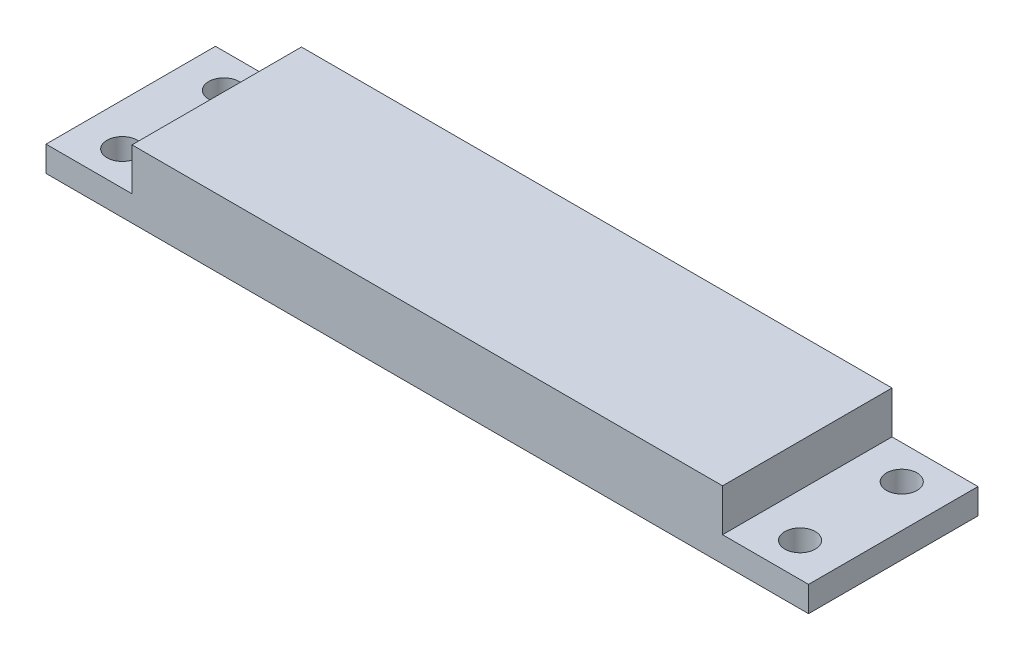
ISO-10303-21;
HEADER;
FILE_DESCRIPTION(('STEP AP214'),'2;1');
FILE_NAME('part.step','',(''),(''),'','','');
FILE_SCHEMA(('AUTOMOTIVE_DESIGN { 1 0 10303 214 1 1 1 1 }'));
ENDSEC;
DATA;
#1=APPLICATION_CONTEXT('core data for automotive mechanical design processes');
#2=APPLICATION_PROTOCOL_DEFINITION('international standard','automotive_design',2000,#1);
#3=PRODUCT_CONTEXT('',#1,'mechanical');
#4=PRODUCT('Part','Part','',(#3));
#5=PRODUCT_RELATED_PRODUCT_CATEGORY('part','',(#4));
#6=PRODUCT_DEFINITION_FORMATION('','',#4);
#7=PRODUCT_DEFINITION_CONTEXT('part definition',#1,'design');
#8=PRODUCT_DEFINITION('design','',#6,#7);
#9=PRODUCT_DEFINITION_SHAPE('','',#8);
#10=(LENGTH_UNIT() NAMED_UNIT(*) SI_UNIT(.MILLI.,.METRE.));
#11=(NAMED_UNIT(*) PLANE_ANGLE_UNIT() SI_UNIT($,.RADIAN.));
#12=(NAMED_UNIT(*) SI_UNIT($,.STERADIAN.) SOLID_ANGLE_UNIT());
#13=UNCERTAINTY_MEASURE_WITH_UNIT(LENGTH_MEASURE(1.E-05),#10,'distance_accuracy_value','');
#14=(GEOMETRIC_REPRESENTATION_CONTEXT(3) GLOBAL_UNCERTAINTY_ASSIGNED_CONTEXT((#13)) GLOBAL_UNIT_ASSIGNED_CONTEXT((#10,
#11,#12)) REPRESENTATION_CONTEXT('',''));
#15=CARTESIAN_POINT('',(0.,0.,0.));
#16=DIRECTION('',(0.,0.,1.));
#17=DIRECTION('',(1.,0.,0.));
#18=AXIS2_PLACEMENT_3D('',#15,#16,#17);
#19=CARTESIAN_POINT('',(0.,3.,0.));
#20=DIRECTION('',(0.,1.,0.));
#21=DIRECTION('',(0.,0.,1.));
#22=AXIS2_PLACEMENT_3D('',#19,#20,#21);
#23=PLANE('',#22);
#24=CARTESIAN_POINT('',(40.,3.,6.00000000000001));
#25=DIRECTION('',(0.,1.,0.));
#26=DIRECTION('',(0.,0.,1.));
#27=AXIS2_PLACEMENT_3D('',#24,#25,#26);
#28=CIRCLE('',#27,1.8);
#29=CARTESIAN_POINT('',(40.,3.,7.8));
#30=VERTEX_POINT('',#29);
#31=EDGE_CURVE('E177',#30,#30,#28,.T.);
#32=ORIENTED_EDGE('',*,*,#31,.F.);
#33=EDGE_LOOP('',(#32));
#34=FACE_BOUND('',#33,.T.);
#35=CARTESIAN_POINT('',(40.,3.,-5.99999999999999));
#36=DIRECTION('',(0.,1.,0.));
#37=DIRECTION('',(0.,0.,1.));
#38=AXIS2_PLACEMENT_3D('',#35,#36,#37);
#39=CIRCLE('',#38,1.8);
#40=CARTESIAN_POINT('',(40.,3.,-4.2));
#41=VERTEX_POINT('',#40);
#42=EDGE_CURVE('E174',#41,#41,#39,.T.);
#43=ORIENTED_EDGE('',*,*,#42,.F.);
#44=EDGE_LOOP('',(#43));
#45=FACE_BOUND('',#44,.T.);
#46=DIRECTION('',(-1.,0.,0.));
#47=VECTOR('',#46,1.);
#48=CARTESIAN_POINT('',(0.,3.,-9.99999999999999));
#49=LINE('',#48,#47);
#50=CARTESIAN_POINT('',(45.,3.,-9.99999999999999));
#51=VERTEX_POINT('',#50);
#52=CARTESIAN_POINT('',(34.85,3.,-9.99999999999999));
#53=VERTEX_POINT('',#52);
#54=EDGE_CURVE('E58',#51,#53,#49,.T.);
#55=ORIENTED_EDGE('',*,*,#54,.T.);
#56=DIRECTION('',(0.,0.,1.));
#57=VECTOR('',#56,1.);
#58=CARTESIAN_POINT('',(34.85,3.,0.));
#59=LINE('',#58,#57);
#60=CARTESIAN_POINT('',(34.85,3.,10.));
#61=VERTEX_POINT('',#60);
#62=EDGE_CURVE('E117',#53,#61,#59,.T.);
#63=ORIENTED_EDGE('',*,*,#62,.T.);
#64=DIRECTION('',(-1.,0.,0.));
#65=VECTOR('',#64,1.);
#66=CARTESIAN_POINT('',(0.,3.,10.));
#67=LINE('',#66,#65);
#68=CARTESIAN_POINT('',(45.,3.,10.));
#69=VERTEX_POINT('',#68);
#70=EDGE_CURVE('E152',#69,#61,#67,.T.);
#71=ORIENTED_EDGE('',*,*,#70,.F.);
#72=DIRECTION('',(0.,0.,-1.));
#73=VECTOR('',#72,1.);
#74=CARTESIAN_POINT('',(45.,3.,0.));
#75=LINE('',#74,#73);
#76=EDGE_CURVE('E154',#69,#51,#75,.T.);
#77=ORIENTED_EDGE('',*,*,#76,.T.);
#78=EDGE_LOOP('',(#55,#63,#71,#77));
#79=FACE_BOUND('',#78,.T.);
#80=ADVANCED_FACE('F41',(#34,#45,#79),#23,.T.);
#81=CARTESIAN_POINT('',(-45.,3.,0.));
#82=DIRECTION('',(-1.,0.,0.));
#83=DIRECTION('',(0.,0.,1.));
#84=AXIS2_PLACEMENT_3D('',#81,#82,#83);
#85=PLANE('',#84);
#86=DIRECTION('',(0.,0.,-1.));
#87=VECTOR('',#86,1.);
#88=CARTESIAN_POINT('',(-45.,0.,0.));
#89=LINE('',#88,#87);
#90=CARTESIAN_POINT('',(-45.,0.,10.));
#91=VERTEX_POINT('',#90);
#92=CARTESIAN_POINT('',(-45.,0.,-9.99999999999999));
#93=VERTEX_POINT('',#92);
#94=EDGE_CURVE('E147',#91,#93,#89,.T.);
#95=ORIENTED_EDGE('',*,*,#94,.F.);
#96=DIRECTION('',(0.,-1.,0.));
#97=VECTOR('',#96,1.);
#98=CARTESIAN_POINT('',(-45.,3.,10.));
#99=LINE('',#98,#97);
#100=CARTESIAN_POINT('',(-45.,3.,10.));
#101=VERTEX_POINT('',#100);
#102=EDGE_CURVE('E11',#101,#91,#99,.T.);
#103=ORIENTED_EDGE('',*,*,#102,.F.);
#104=DIRECTION('',(0.,0.,-1.));
#105=VECTOR('',#104,1.);
#106=CARTESIAN_POINT('',(-45.,3.,0.));
#107=LINE('',#106,#105);
#108=CARTESIAN_POINT('',(-45.,3.,-9.99999999999999));
#109=VERTEX_POINT('',#108);
#110=EDGE_CURVE('E148',#101,#109,#107,.T.);
#111=ORIENTED_EDGE('',*,*,#110,.T.);
#112=DIRECTION('',(0.,-1.,0.));
#113=VECTOR('',#112,1.);
#114=CARTESIAN_POINT('',(-45.,3.,-9.99999999999999));
#115=LINE('',#114,#113);
#116=EDGE_CURVE('E158',#109,#93,#115,.T.);
#117=ORIENTED_EDGE('',*,*,#116,.T.);
#118=EDGE_LOOP('',(#95,#103,#111,#117));
#119=FACE_BOUND('',#118,.T.);
#120=ADVANCED_FACE('F43',(#119),#85,.T.);
#121=CARTESIAN_POINT('',(0.,3.,10.));
#122=DIRECTION('',(0.,0.,1.));
#123=DIRECTION('',(1.,0.,0.));
#124=AXIS2_PLACEMENT_3D('',#121,#122,#123);
#125=PLANE('',#124);
#126=ORIENTED_EDGE('',*,*,#102,.T.);
#127=DIRECTION('',(-1.,0.,0.));
#128=VECTOR('',#127,1.);
#129=CARTESIAN_POINT('',(0.,0.,10.));
#130=LINE('',#129,#128);
#131=CARTESIAN_POINT('',(45.,0.,10.));
#132=VERTEX_POINT('',#131);
#133=EDGE_CURVE('E161',#132,#91,#130,.T.);
#134=ORIENTED_EDGE('',*,*,#133,.F.);
#135=DIRECTION('',(0.,-1.,0.));
#136=VECTOR('',#135,1.);
#137=CARTESIAN_POINT('',(45.,3.,10.));
#138=LINE('',#137,#136);
#139=EDGE_CURVE('E50',#69,#132,#138,.T.);
#140=ORIENTED_EDGE('',*,*,#139,.F.);
#141=ORIENTED_EDGE('',*,*,#70,.T.);
#142=DIRECTION('',(0.,-1.,0.));
#143=VECTOR('',#142,1.);
#144=CARTESIAN_POINT('',(34.85,8.,9.99999999999999));
#145=LINE('',#144,#143);
#146=CARTESIAN_POINT('',(34.85,8.,9.99999999999999));
#147=VERTEX_POINT('',#146);
#148=EDGE_CURVE('E118',#147,#61,#145,.T.);
#149=ORIENTED_EDGE('',*,*,#148,.F.);
#150=DIRECTION('',(-1.,0.,0.));
#151=VECTOR('',#150,1.);
#152=CARTESIAN_POINT('',(0.,8.,10.));
#153=LINE('',#152,#151);
#154=CARTESIAN_POINT('',(-34.85,8.,10.));
#155=VERTEX_POINT('',#154);
#156=EDGE_CURVE('E123',#147,#155,#153,.T.);
#157=ORIENTED_EDGE('',*,*,#156,.T.);
#158=DIRECTION('',(0.,-1.,0.));
#159=VECTOR('',#158,1.);
#160=CARTESIAN_POINT('',(-34.85,8.,10.));
#161=LINE('',#160,#159);
#162=CARTESIAN_POINT('',(-34.85,3.,10.));
#163=VERTEX_POINT('',#162);
#164=EDGE_CURVE('E109',#155,#163,#161,.T.);
#165=ORIENTED_EDGE('',*,*,#164,.T.);
#166=EDGE_CURVE('E66',#163,#101,#67,.T.);
#167=ORIENTED_EDGE('',*,*,#166,.T.);
#168=EDGE_LOOP('',(#126,#134,#140,#141,#149,#157,#165,#167));
#169=FACE_BOUND('',#168,.T.);
#170=ADVANCED_FACE('F129',(#169),#125,.T.);
#171=CARTESIAN_POINT('',(45.,3.,0.));
#172=DIRECTION('',(-1.,0.,0.));
#173=DIRECTION('',(0.,0.,1.));
#174=AXIS2_PLACEMENT_3D('',#171,#172,#173);
#175=PLANE('',#174);
#176=DIRECTION('',(0.,0.,-1.));
#177=VECTOR('',#176,1.);
#178=CARTESIAN_POINT('',(45.,0.,0.));
#179=LINE('',#178,#177);
#180=CARTESIAN_POINT('',(45.,0.,-9.99999999999999));
#181=VERTEX_POINT('',#180);
#182=EDGE_CURVE('E163',#132,#181,#179,.T.);
#183=ORIENTED_EDGE('',*,*,#182,.T.);
#184=DIRECTION('',(0.,-1.,0.));
#185=VECTOR('',#184,1.);
#186=CARTESIAN_POINT('',(45.,3.,-9.99999999999999));
#187=LINE('',#186,#185);
#188=EDGE_CURVE('E168',#51,#181,#187,.T.);
#189=ORIENTED_EDGE('',*,*,#188,.F.);
#190=ORIENTED_EDGE('',*,*,#76,.F.);
#191=ORIENTED_EDGE('',*,*,#139,.T.);
#192=EDGE_LOOP('',(#183,#189,#190,#191));
#193=FACE_BOUND('',#192,.T.);
#194=ADVANCED_FACE('F218',(#193),#175,.F.);
#195=CARTESIAN_POINT('',(0.,3.,-9.99999999999999));
#196=DIRECTION('',(0.,0.,1.));
#197=DIRECTION('',(1.,0.,0.));
#198=AXIS2_PLACEMENT_3D('',#195,#196,#197);
#199=PLANE('',#198);
#200=CARTESIAN_POINT('',(-34.85,3.,-10.));
#201=VERTEX_POINT('',#200);
#202=EDGE_CURVE('E156',#201,#109,#49,.T.);
#203=ORIENTED_EDGE('',*,*,#202,.F.);
#204=DIRECTION('',(0.,-1.,0.));
#205=VECTOR('',#204,1.);
#206=CARTESIAN_POINT('',(-34.85,8.,-10.));
#207=LINE('',#206,#205);
#208=CARTESIAN_POINT('',(-34.85,8.,-10.));
#209=VERTEX_POINT('',#208);
#210=EDGE_CURVE('E139',#209,#201,#207,.T.);
#211=ORIENTED_EDGE('',*,*,#210,.F.);
#212=DIRECTION('',(-1.,0.,0.));
#213=VECTOR('',#212,1.);
#214=CARTESIAN_POINT('',(0.,8.,-10.));
#215=LINE('',#214,#213);
#216=CARTESIAN_POINT('',(34.85,8.,-10.));
#217=VERTEX_POINT('',#216);
#218=EDGE_CURVE('E125',#217,#209,#215,.T.);
#219=ORIENTED_EDGE('',*,*,#218,.F.);
#220=DIRECTION('',(0.,-1.,0.));
#221=VECTOR('',#220,1.);
#222=CARTESIAN_POINT('',(34.85,8.,-10.));
#223=LINE('',#222,#221);
#224=EDGE_CURVE('E141',#217,#53,#223,.T.);
#225=ORIENTED_EDGE('',*,*,#224,.T.);
#226=ORIENTED_EDGE('',*,*,#54,.F.);
#227=ORIENTED_EDGE('',*,*,#188,.T.);
#228=DIRECTION('',(-1.,0.,0.));
#229=VECTOR('',#228,1.);
#230=CARTESIAN_POINT('',(0.,0.,-9.99999999999999));
#231=LINE('',#230,#229);
#232=EDGE_CURVE('E151',#181,#93,#231,.T.);
#233=ORIENTED_EDGE('',*,*,#232,.T.);
#234=ORIENTED_EDGE('',*,*,#116,.F.);
#235=EDGE_LOOP('',(#203,#211,#219,#225,#226,#227,#233,#234));
#236=FACE_BOUND('',#235,.T.);
#237=ADVANCED_FACE('F211',(#236),#199,.F.);
#238=CARTESIAN_POINT('',(-40.,3.,-6.));
#239=DIRECTION('',(0.,1.,0.));
#240=DIRECTION('',(0.,0.,1.));
#241=AXIS2_PLACEMENT_3D('',#238,#239,#240);
#242=CIRCLE('',#241,1.8);
#243=CARTESIAN_POINT('',(-40.,3.,-4.2));
#244=VERTEX_POINT('',#243);
#245=EDGE_CURVE('E190',#244,#244,#242,.T.);
#246=ORIENTED_EDGE('',*,*,#245,.F.);
#247=EDGE_LOOP('',(#246));
#248=FACE_BOUND('',#247,.T.);
#249=CARTESIAN_POINT('',(-40.,3.,6.00000000000001));
#250=DIRECTION('',(0.,1.,0.));
#251=DIRECTION('',(0.,0.,1.));
#252=AXIS2_PLACEMENT_3D('',#249,#250,#251);
#253=CIRCLE('',#252,1.8);
#254=CARTESIAN_POINT('',(-40.,3.,7.8));
#255=VERTEX_POINT('',#254);
#256=EDGE_CURVE('E180',#255,#255,#253,.T.);
#257=ORIENTED_EDGE('',*,*,#256,.F.);
#258=EDGE_LOOP('',(#257));
#259=FACE_BOUND('',#258,.T.);
#260=DIRECTION('',(0.,0.,1.));
#261=VECTOR('',#260,1.);
#262=CARTESIAN_POINT('',(-34.85,3.,0.));
#263=LINE('',#262,#261);
#264=EDGE_CURVE('E114',#201,#163,#263,.T.);
#265=ORIENTED_EDGE('',*,*,#264,.F.);
#266=ORIENTED_EDGE('',*,*,#202,.T.);
#267=ORIENTED_EDGE('',*,*,#110,.F.);
#268=ORIENTED_EDGE('',*,*,#166,.F.);
#269=EDGE_LOOP('',(#265,#266,#267,#268));
#270=FACE_BOUND('',#269,.T.);
#271=ADVANCED_FACE('F201',(#248,#259,#270),#23,.T.);
#272=CARTESIAN_POINT('',(0.,0.,0.));
#273=DIRECTION('',(0.,1.,0.));
#274=DIRECTION('',(0.,0.,1.));
#275=AXIS2_PLACEMENT_3D('',#272,#273,#274);
#276=PLANE('',#275);
#277=CARTESIAN_POINT('',(-40.,0.,-6.));
#278=DIRECTION('',(0.,1.,0.));
#279=DIRECTION('',(0.,0.,1.));
#280=AXIS2_PLACEMENT_3D('',#277,#278,#279);
#281=CIRCLE('',#280,1.8);
#282=CARTESIAN_POINT('',(-40.,0.,-4.2));
#283=VERTEX_POINT('',#282);
#284=EDGE_CURVE('E45',#283,#283,#281,.T.);
#285=ORIENTED_EDGE('',*,*,#284,.T.);
#286=EDGE_LOOP('',(#285));
#287=FACE_BOUND('',#286,.T.);
#288=CARTESIAN_POINT('',(-40.,0.,6.00000000000001));
#289=DIRECTION('',(0.,1.,0.));
#290=DIRECTION('',(0.,0.,1.));
#291=AXIS2_PLACEMENT_3D('',#288,#289,#290);
#292=CIRCLE('',#291,1.8);
#293=CARTESIAN_POINT('',(-40.,0.,7.8));
#294=VERTEX_POINT('',#293);
#295=EDGE_CURVE('E178',#294,#294,#292,.T.);
#296=ORIENTED_EDGE('',*,*,#295,.T.);
#297=EDGE_LOOP('',(#296));
#298=FACE_BOUND('',#297,.T.);
#299=CARTESIAN_POINT('',(40.,0.,6.00000000000001));
#300=DIRECTION('',(0.,1.,0.));
#301=DIRECTION('',(0.,0.,1.));
#302=AXIS2_PLACEMENT_3D('',#299,#300,#301);
#303=CIRCLE('',#302,1.8);
#304=CARTESIAN_POINT('',(40.,0.,7.8));
#305=VERTEX_POINT('',#304);
#306=EDGE_CURVE('E175',#305,#305,#303,.T.);
#307=ORIENTED_EDGE('',*,*,#306,.T.);
#308=EDGE_LOOP('',(#307));
#309=FACE_BOUND('',#308,.T.);
#310=CARTESIAN_POINT('',(40.,0.,-5.99999999999999));
#311=DIRECTION('',(0.,1.,0.));
#312=DIRECTION('',(0.,0.,1.));
#313=AXIS2_PLACEMENT_3D('',#310,#311,#312);
#314=CIRCLE('',#313,1.8);
#315=CARTESIAN_POINT('',(40.,0.,-4.2));
#316=VERTEX_POINT('',#315);
#317=EDGE_CURVE('E127',#316,#316,#314,.T.);
#318=ORIENTED_EDGE('',*,*,#317,.T.);
#319=EDGE_LOOP('',(#318));
#320=FACE_BOUND('',#319,.T.);
#321=ORIENTED_EDGE('',*,*,#94,.T.);
#322=ORIENTED_EDGE('',*,*,#232,.F.);
#323=ORIENTED_EDGE('',*,*,#182,.F.);
#324=ORIENTED_EDGE('',*,*,#133,.T.);
#325=EDGE_LOOP('',(#321,#322,#323,#324));
#326=FACE_BOUND('',#325,.T.);
#327=ADVANCED_FACE('F210',(#287,#298,#309,#320,#326),#276,.F.);
#328=CARTESIAN_POINT('',(-34.85,8.,0.));
#329=DIRECTION('',(-1.,0.,0.));
#330=DIRECTION('',(0.,0.,1.));
#331=AXIS2_PLACEMENT_3D('',#328,#329,#330);
#332=PLANE('',#331);
#333=ORIENTED_EDGE('',*,*,#210,.T.);
#334=ORIENTED_EDGE('',*,*,#264,.T.);
#335=ORIENTED_EDGE('',*,*,#164,.F.);
#336=DIRECTION('',(0.,0.,-1.));
#337=VECTOR('',#336,1.);
#338=CARTESIAN_POINT('',(-34.85,8.,0.));
#339=LINE('',#338,#337);
#340=EDGE_CURVE('E113',#155,#209,#339,.T.);
#341=ORIENTED_EDGE('',*,*,#340,.T.);
#342=EDGE_LOOP('',(#333,#334,#335,#341));
#343=FACE_BOUND('',#342,.T.);
#344=ADVANCED_FACE('F112',(#343),#332,.T.);
#345=CARTESIAN_POINT('',(34.85,8.,0.));
#346=DIRECTION('',(-1.,0.,0.));
#347=DIRECTION('',(0.,0.,1.));
#348=AXIS2_PLACEMENT_3D('',#345,#346,#347);
#349=PLANE('',#348);
#350=ORIENTED_EDGE('',*,*,#62,.F.);
#351=ORIENTED_EDGE('',*,*,#224,.F.);
#352=DIRECTION('',(0.,0.,-1.));
#353=VECTOR('',#352,1.);
#354=CARTESIAN_POINT('',(34.85,8.,0.));
#355=LINE('',#354,#353);
#356=EDGE_CURVE('E133',#147,#217,#355,.T.);
#357=ORIENTED_EDGE('',*,*,#356,.F.);
#358=ORIENTED_EDGE('',*,*,#148,.T.);
#359=EDGE_LOOP('',(#350,#351,#357,#358));
#360=FACE_BOUND('',#359,.T.);
#361=ADVANCED_FACE('F236',(#360),#349,.F.);
#362=CARTESIAN_POINT('',(0.,8.,0.));
#363=DIRECTION('',(0.,1.,0.));
#364=DIRECTION('',(0.,0.,1.));
#365=AXIS2_PLACEMENT_3D('',#362,#363,#364);
#366=PLANE('',#365);
#367=ORIENTED_EDGE('',*,*,#340,.F.);
#368=ORIENTED_EDGE('',*,*,#156,.F.);
#369=ORIENTED_EDGE('',*,*,#356,.T.);
#370=ORIENTED_EDGE('',*,*,#218,.T.);
#371=EDGE_LOOP('',(#367,#368,#369,#370));
#372=FACE_BOUND('',#371,.T.);
#373=ADVANCED_FACE('F122',(#372),#366,.T.);
#374=CARTESIAN_POINT('',(40.,3.,-5.99999999999999));
#375=DIRECTION('',(0.,1.,0.));
#376=DIRECTION('',(0.,0.,1.));
#377=AXIS2_PLACEMENT_3D('',#374,#375,#376);
#378=CYLINDRICAL_SURFACE('',#377,1.8);
#379=ORIENTED_EDGE('',*,*,#42,.T.);
#380=EDGE_LOOP('',(#379));
#381=FACE_BOUND('',#380,.T.);
#382=ORIENTED_EDGE('',*,*,#317,.F.);
#383=EDGE_LOOP('',(#382));
#384=FACE_BOUND('',#383,.T.);
#385=ADVANCED_FACE('F195',(#381,#384),#378,.F.);
#386=CARTESIAN_POINT('',(40.,3.,6.00000000000001));
#387=DIRECTION('',(0.,1.,0.));
#388=DIRECTION('',(0.,0.,1.));
#389=AXIS2_PLACEMENT_3D('',#386,#387,#388);
#390=CYLINDRICAL_SURFACE('',#389,1.8);
#391=ORIENTED_EDGE('',*,*,#31,.T.);
#392=EDGE_LOOP('',(#391));
#393=FACE_BOUND('',#392,.T.);
#394=ORIENTED_EDGE('',*,*,#306,.F.);
#395=EDGE_LOOP('',(#394));
#396=FACE_BOUND('',#395,.T.);
#397=ADVANCED_FACE('F248',(#393,#396),#390,.F.);
#398=CARTESIAN_POINT('',(-40.,3.,6.00000000000001));
#399=DIRECTION('',(0.,1.,0.));
#400=DIRECTION('',(0.,0.,1.));
#401=AXIS2_PLACEMENT_3D('',#398,#399,#400);
#402=CYLINDRICAL_SURFACE('',#401,1.8);
#403=ORIENTED_EDGE('',*,*,#256,.T.);
#404=EDGE_LOOP('',(#403));
#405=FACE_BOUND('',#404,.T.);
#406=ORIENTED_EDGE('',*,*,#295,.F.);
#407=EDGE_LOOP('',(#406));
#408=FACE_BOUND('',#407,.T.);
#409=ADVANCED_FACE('F251',(#405,#408),#402,.F.);
#410=CARTESIAN_POINT('',(-40.,3.,-6.));
#411=DIRECTION('',(0.,1.,0.));
#412=DIRECTION('',(0.,0.,1.));
#413=AXIS2_PLACEMENT_3D('',#410,#411,#412);
#414=CYLINDRICAL_SURFACE('',#413,1.8);
#415=ORIENTED_EDGE('',*,*,#245,.T.);
#416=EDGE_LOOP('',(#415));
#417=FACE_BOUND('',#416,.T.);
#418=ORIENTED_EDGE('',*,*,#284,.F.);
#419=EDGE_LOOP('',(#418));
#420=FACE_BOUND('',#419,.T.);
#421=ADVANCED_FACE('F255',(#417,#420),#414,.F.);
#422=CLOSED_SHELL('',(#80,#120,#170,#194,#237,#271,#327,#344,#361,#373,#385,#397,#409,#421));
#423=MANIFOLD_SOLID_BREP('B2',#422);
#424=ADVANCED_BREP_SHAPE_REPRESENTATION('',(#18,#423),#14);
#425=SHAPE_DEFINITION_REPRESENTATION(#9,#424);
ENDSEC;
END-ISO-10303-21;
